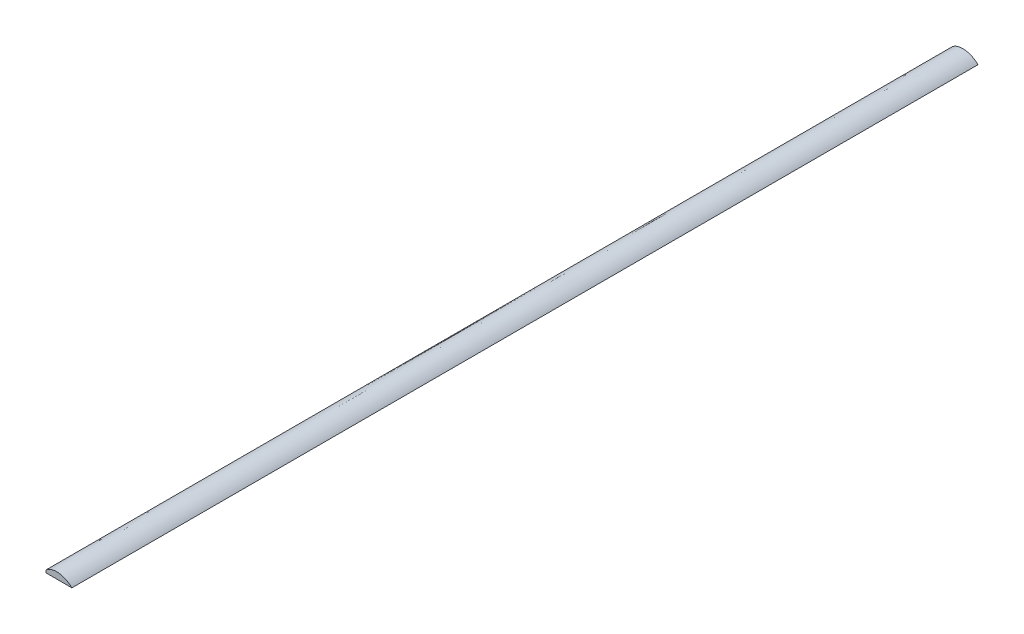
ISO-10303-21;
HEADER;
FILE_DESCRIPTION(('STEP AP214'),'2;1');
FILE_NAME('part.step','',(''),(''),'','','');
FILE_SCHEMA(('AUTOMOTIVE_DESIGN { 1 0 10303 214 1 1 1 1 }'));
ENDSEC;
DATA;
#1=APPLICATION_CONTEXT('core data for automotive mechanical design processes');
#2=APPLICATION_PROTOCOL_DEFINITION('international standard','automotive_design',2000,#1);
#3=PRODUCT_CONTEXT('',#1,'mechanical');
#4=PRODUCT('Part','Part','',(#3));
#5=PRODUCT_RELATED_PRODUCT_CATEGORY('part','',(#4));
#6=PRODUCT_DEFINITION_FORMATION('','',#4);
#7=PRODUCT_DEFINITION_CONTEXT('part definition',#1,'design');
#8=PRODUCT_DEFINITION('design','',#6,#7);
#9=PRODUCT_DEFINITION_SHAPE('','',#8);
#10=(LENGTH_UNIT() NAMED_UNIT(*) SI_UNIT(.MILLI.,.METRE.));
#11=(NAMED_UNIT(*) PLANE_ANGLE_UNIT() SI_UNIT($,.RADIAN.));
#12=(NAMED_UNIT(*) SI_UNIT($,.STERADIAN.) SOLID_ANGLE_UNIT());
#13=UNCERTAINTY_MEASURE_WITH_UNIT(LENGTH_MEASURE(1.E-05),#10,'distance_accuracy_value','');
#14=(GEOMETRIC_REPRESENTATION_CONTEXT(3) GLOBAL_UNCERTAINTY_ASSIGNED_CONTEXT((#13)) GLOBAL_UNIT_ASSIGNED_CONTEXT((#10,
#11,#12)) REPRESENTATION_CONTEXT('',''));
#15=CARTESIAN_POINT('',(0.,0.,0.));
#16=DIRECTION('',(0.,0.,1.));
#17=DIRECTION('',(1.,0.,0.));
#18=AXIS2_PLACEMENT_3D('',#15,#16,#17);
#19=CARTESIAN_POINT('',(0.,0.,-70.));
#20=DIRECTION('',(-1.,0.,0.));
#21=DIRECTION('',(0.,0.,1.));
#22=AXIS2_PLACEMENT_3D('',#19,#20,#21);
#23=PLANE('',#22);
#24=DIRECTION('',(0.,-1.,0.));
#25=VECTOR('',#24,1.);
#26=CARTESIAN_POINT('',(0.,0.,0.));
#27=LINE('',#26,#25);
#28=CARTESIAN_POINT('',(0.,0.2,0.));
#29=VERTEX_POINT('',#28);
#30=CARTESIAN_POINT('',(0.,0.,0.));
#31=VERTEX_POINT('',#30);
#32=EDGE_CURVE('E87',#29,#31,#27,.T.);
#33=ORIENTED_EDGE('',*,*,#32,.F.);
#34=DIRECTION('',(0.,0.,1.));
#35=VECTOR('',#34,1.);
#36=CARTESIAN_POINT('',(0.,0.2,-70.));
#37=LINE('',#36,#35);
#38=CARTESIAN_POINT('',(0.,0.2,-70.));
#39=VERTEX_POINT('',#38);
#40=EDGE_CURVE('E11',#39,#29,#37,.T.);
#41=ORIENTED_EDGE('',*,*,#40,.F.);
#42=DIRECTION('',(0.,-1.,0.));
#43=VECTOR('',#42,1.);
#44=CARTESIAN_POINT('',(0.,0.,-70.));
#45=LINE('',#44,#43);
#46=CARTESIAN_POINT('',(0.,0.,-70.));
#47=VERTEX_POINT('',#46);
#48=EDGE_CURVE('E76',#39,#47,#45,.T.);
#49=ORIENTED_EDGE('',*,*,#48,.T.);
#50=DIRECTION('',(0.,0.,1.));
#51=VECTOR('',#50,1.);
#52=CARTESIAN_POINT('',(0.,0.,-70.));
#53=LINE('',#52,#51);
#54=EDGE_CURVE('E35',#47,#31,#53,.T.);
#55=ORIENTED_EDGE('',*,*,#54,.T.);
#56=EDGE_LOOP('',(#33,#41,#49,#55));
#57=FACE_BOUND('',#56,.T.);
#58=ADVANCED_FACE('F32',(#57),#23,.T.);
#59=CARTESIAN_POINT('',(2.,0.,-70.));
#60=CARTESIAN_POINT('',(1.50922526322279,0.507093259340425,-70.));
#61=CARTESIAN_POINT('',(0.560678206617697,0.701005150171101,-70.));
#62=CARTESIAN_POINT('',(0.,0.2,-70.));
#63=B_SPLINE_CURVE_WITH_KNOTS('',3,(#59,#60,#61,#62),.UNSPECIFIED.,.F.,.F.,(4,4),(0.,1.),.UNSPECIFIED.);
#64=DIRECTION('',(0.,0.,1.));
#65=VECTOR('',#64,1.);
#66=SURFACE_OF_LINEAR_EXTRUSION('',#63,#65);
#67=CARTESIAN_POINT('',(2.,0.,0.));
#68=CARTESIAN_POINT('',(1.50922526322279,0.507093259340425,0.));
#69=CARTESIAN_POINT('',(0.560678206617697,0.701005150171101,0.));
#70=CARTESIAN_POINT('',(0.,0.2,0.));
#71=B_SPLINE_CURVE_WITH_KNOTS('',3,(#67,#68,#69,#70),.UNSPECIFIED.,.F.,.F.,(4,4),(0.,1.),.UNSPECIFIED.);
#72=CARTESIAN_POINT('',(2.,0.,0.));
#73=VERTEX_POINT('',#72);
#74=EDGE_CURVE('E78',#73,#29,#71,.T.);
#75=ORIENTED_EDGE('',*,*,#74,.F.);
#76=DIRECTION('',(0.,0.,1.));
#77=VECTOR('',#76,1.);
#78=CARTESIAN_POINT('',(2.,0.,-70.));
#79=LINE('',#78,#77);
#80=CARTESIAN_POINT('',(2.,0.,-70.));
#81=VERTEX_POINT('',#80);
#82=EDGE_CURVE('E41',#81,#73,#79,.T.);
#83=ORIENTED_EDGE('',*,*,#82,.F.);
#84=EDGE_CURVE('E73',#81,#39,#63,.T.);
#85=ORIENTED_EDGE('',*,*,#84,.T.);
#86=ORIENTED_EDGE('',*,*,#40,.T.);
#87=EDGE_LOOP('',(#75,#83,#85,#86));
#88=FACE_BOUND('',#87,.T.);
#89=ADVANCED_FACE('F93',(#88),#66,.T.);
#90=CARTESIAN_POINT('',(0.,0.,-70.));
#91=DIRECTION('',(0.,-1.,0.));
#92=DIRECTION('',(0.,0.,-1.));
#93=AXIS2_PLACEMENT_3D('',#90,#91,#92);
#94=PLANE('',#93);
#95=DIRECTION('',(1.,0.,0.));
#96=VECTOR('',#95,1.);
#97=CARTESIAN_POINT('',(0.,0.,0.));
#98=LINE('',#97,#96);
#99=EDGE_CURVE('E71',#31,#73,#98,.T.);
#100=ORIENTED_EDGE('',*,*,#99,.F.);
#101=ORIENTED_EDGE('',*,*,#54,.F.);
#102=DIRECTION('',(1.,0.,0.));
#103=VECTOR('',#102,1.);
#104=CARTESIAN_POINT('',(0.,0.,-70.));
#105=LINE('',#104,#103);
#106=EDGE_CURVE('E69',#47,#81,#105,.T.);
#107=ORIENTED_EDGE('',*,*,#106,.T.);
#108=ORIENTED_EDGE('',*,*,#82,.T.);
#109=EDGE_LOOP('',(#100,#101,#107,#108));
#110=FACE_BOUND('',#109,.T.);
#111=ADVANCED_FACE('F68',(#110),#94,.T.);
#112=CARTESIAN_POINT('',(1.02621380119018,0.478036903566822,-70.));
#113=DIRECTION('',(0.,0.,1.));
#114=DIRECTION('',(1.,0.,0.));
#115=AXIS2_PLACEMENT_3D('',#112,#113,#114);
#116=PLANE('',#115);
#117=ORIENTED_EDGE('',*,*,#48,.F.);
#118=ORIENTED_EDGE('',*,*,#84,.F.);
#119=ORIENTED_EDGE('',*,*,#106,.F.);
#120=EDGE_LOOP('',(#117,#118,#119));
#121=FACE_BOUND('',#120,.T.);
#122=ADVANCED_FACE('F75',(#121),#116,.F.);
#123=CARTESIAN_POINT('',(1.02621380119018,0.478036903566822,0.));
#124=DIRECTION('',(0.,0.,1.));
#125=DIRECTION('',(1.,0.,0.));
#126=AXIS2_PLACEMENT_3D('',#123,#124,#125);
#127=PLANE('',#126);
#128=ORIENTED_EDGE('',*,*,#32,.T.);
#129=ORIENTED_EDGE('',*,*,#99,.T.);
#130=ORIENTED_EDGE('',*,*,#74,.T.);
#131=EDGE_LOOP('',(#128,#129,#130));
#132=FACE_BOUND('',#131,.T.);
#133=ADVANCED_FACE('F96',(#132),#127,.T.);
#134=CLOSED_SHELL('',(#58,#89,#111,#122,#133));
#135=MANIFOLD_SOLID_BREP('B2',#134);
#136=ADVANCED_BREP_SHAPE_REPRESENTATION('',(#18,#135),#14);
#137=SHAPE_DEFINITION_REPRESENTATION(#9,#136);
ENDSEC;
END-ISO-10303-21;
